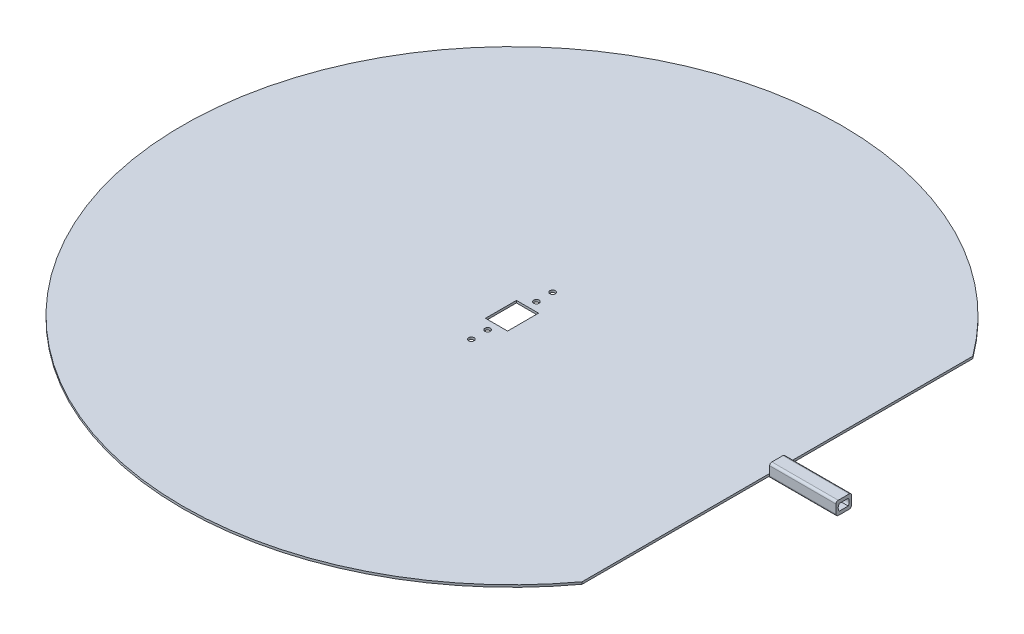
ISO-10303-21;
HEADER;
FILE_DESCRIPTION(('STEP AP214'),'2;1');
FILE_NAME('part.step','',(''),(''),'','','');
FILE_SCHEMA(('AUTOMOTIVE_DESIGN { 1 0 10303 214 1 1 1 1 }'));
ENDSEC;
DATA;
#1=APPLICATION_CONTEXT('core data for automotive mechanical design processes');
#2=APPLICATION_PROTOCOL_DEFINITION('international standard','automotive_design',2000,#1);
#3=PRODUCT_CONTEXT('',#1,'mechanical');
#4=PRODUCT('Part','Part','',(#3));
#5=PRODUCT_RELATED_PRODUCT_CATEGORY('part','',(#4));
#6=PRODUCT_DEFINITION_FORMATION('','',#4);
#7=PRODUCT_DEFINITION_CONTEXT('part definition',#1,'design');
#8=PRODUCT_DEFINITION('design','',#6,#7);
#9=PRODUCT_DEFINITION_SHAPE('','',#8);
#10=(LENGTH_UNIT() NAMED_UNIT(*) SI_UNIT(.MILLI.,.METRE.));
#11=(NAMED_UNIT(*) PLANE_ANGLE_UNIT() SI_UNIT($,.RADIAN.));
#12=(NAMED_UNIT(*) SI_UNIT($,.STERADIAN.) SOLID_ANGLE_UNIT());
#13=UNCERTAINTY_MEASURE_WITH_UNIT(LENGTH_MEASURE(1.E-05),#10,'distance_accuracy_value','');
#14=(GEOMETRIC_REPRESENTATION_CONTEXT(3) GLOBAL_UNCERTAINTY_ASSIGNED_CONTEXT((#13)) GLOBAL_UNIT_ASSIGNED_CONTEXT((#10,
#11,#12)) REPRESENTATION_CONTEXT('',''));
#15=CARTESIAN_POINT('',(0.,0.,0.));
#16=DIRECTION('',(0.,0.,1.));
#17=DIRECTION('',(1.,0.,0.));
#18=AXIS2_PLACEMENT_3D('',#15,#16,#17);
#19=CARTESIAN_POINT('',(0.,-2.,0.));
#20=DIRECTION('',(0.,1.,0.));
#21=DIRECTION('',(0.,0.,1.));
#22=AXIS2_PLACEMENT_3D('',#19,#20,#21);
#23=PLANE('',#22);
#24=CARTESIAN_POINT('',(0.,-2.,-18.4));
#25=DIRECTION('',(0.,1.,0.));
#26=DIRECTION('',(0.,0.,1.));
#27=AXIS2_PLACEMENT_3D('',#24,#25,#26);
#28=CIRCLE('',#27,1.25);
#29=CARTESIAN_POINT('',(0.,-2.,-17.15));
#30=VERTEX_POINT('',#29);
#31=EDGE_CURVE('E422',#30,#30,#28,.T.);
#32=ORIENTED_EDGE('',*,*,#31,.T.);
#33=EDGE_LOOP('',(#32));
#34=FACE_BOUND('',#33,.T.);
#35=CARTESIAN_POINT('',(0.,-2.,-11.));
#36=DIRECTION('',(0.,1.,0.));
#37=DIRECTION('',(0.,0.,1.));
#38=AXIS2_PLACEMENT_3D('',#35,#36,#37);
#39=CIRCLE('',#38,1.25);
#40=CARTESIAN_POINT('',(0.,-2.,-9.75));
#41=VERTEX_POINT('',#40);
#42=EDGE_CURVE('E416',#41,#41,#39,.T.);
#43=ORIENTED_EDGE('',*,*,#42,.T.);
#44=EDGE_LOOP('',(#43));
#45=FACE_BOUND('',#44,.T.);
#46=CARTESIAN_POINT('',(0.,-2.,18.4));
#47=DIRECTION('',(0.,1.,0.));
#48=DIRECTION('',(0.,0.,1.));
#49=AXIS2_PLACEMENT_3D('',#46,#47,#48);
#50=CIRCLE('',#49,1.25);
#51=CARTESIAN_POINT('',(0.,-2.,19.65));
#52=VERTEX_POINT('',#51);
#53=EDGE_CURVE('E410',#52,#52,#50,.T.);
#54=ORIENTED_EDGE('',*,*,#53,.T.);
#55=EDGE_LOOP('',(#54));
#56=FACE_BOUND('',#55,.T.);
#57=CARTESIAN_POINT('',(0.,-2.,11.));
#58=DIRECTION('',(0.,1.,0.));
#59=DIRECTION('',(0.,0.,1.));
#60=AXIS2_PLACEMENT_3D('',#57,#58,#59);
#61=CIRCLE('',#60,1.25);
#62=CARTESIAN_POINT('',(0.,-2.,12.25));
#63=VERTEX_POINT('',#62);
#64=EDGE_CURVE('E404',#63,#63,#61,.T.);
#65=ORIENTED_EDGE('',*,*,#64,.T.);
#66=EDGE_LOOP('',(#65));
#67=FACE_BOUND('',#66,.T.);
#68=DIRECTION('',(-0.999999999999999,0.,5.34839591885549E-08));
#69=VECTOR('',#68,1.);
#70=CARTESIAN_POINT('',(3.74387700017215E-07,-2.,6.9999997325802));
#71=LINE('',#70,#69);
#72=CARTESIAN_POINT('',(5.00000000000002,-2.,6.99999946516043));
#73=VERTEX_POINT('',#72);
#74=CARTESIAN_POINT('',(-4.99999999999998,-2.,7.00000000000002));
#75=VERTEX_POINT('',#74);
#76=EDGE_CURVE('E396',#73,#75,#71,.T.);
#77=ORIENTED_EDGE('',*,*,#76,.F.);
#78=DIRECTION('',(0.,0.,-1.));
#79=VECTOR('',#78,1.);
#80=CARTESIAN_POINT('',(5.,-2.,0.));
#81=LINE('',#80,#79);
#82=CARTESIAN_POINT('',(4.99999999999998,-2.,-7.00000000000002));
#83=VERTEX_POINT('',#82);
#84=EDGE_CURVE('E398',#73,#83,#81,.T.);
#85=ORIENTED_EDGE('',*,*,#84,.T.);
#86=DIRECTION('',(-1.,0.,0.));
#87=VECTOR('',#86,1.);
#88=CARTESIAN_POINT('',(0.,-2.,-7.));
#89=LINE('',#88,#87);
#90=CARTESIAN_POINT('',(-5.00000038202827,-2.,-6.99999999999998));
#91=VERTEX_POINT('',#90);
#92=EDGE_CURVE('E383',#83,#91,#89,.T.);
#93=ORIENTED_EDGE('',*,*,#92,.T.);
#94=DIRECTION('',(-2.72877354393075E-08,0.,-1.));
#95=VECTOR('',#94,1.);
#96=CARTESIAN_POINT('',(-5.00000019101412,-2.,1.3643868240888E-07));
#97=LINE('',#96,#95);
#98=EDGE_CURVE('E393',#75,#91,#97,.T.);
#99=ORIENTED_EDGE('',*,*,#98,.F.);
#100=EDGE_LOOP('',(#77,#85,#93,#99));
#101=FACE_BOUND('',#100,.T.);
#102=DIRECTION('',(1.,0.,0.));
#103=VECTOR('',#102,1.);
#104=CARTESIAN_POINT('',(100.,-2.,-3.5));
#105=LINE('',#104,#103);
#106=CARTESIAN_POINT('',(100.,-2.,-3.5));
#107=VERTEX_POINT('',#106);
#108=CARTESIAN_POINT('',(120.,-2.,-3.5));
#109=VERTEX_POINT('',#108);
#110=EDGE_CURVE('E225',#107,#109,#105,.T.);
#111=ORIENTED_EDGE('',*,*,#110,.F.);
#112=DIRECTION('',(0.,0.,-1.));
#113=VECTOR('',#112,1.);
#114=CARTESIAN_POINT('',(100.,-2.,-3.5));
#115=LINE('',#114,#113);
#116=CARTESIAN_POINT('',(100.,-2.,3.5));
#117=VERTEX_POINT('',#116);
#118=EDGE_CURVE('E222',#117,#107,#115,.T.);
#119=ORIENTED_EDGE('',*,*,#118,.F.);
#120=DIRECTION('',(1.,0.,0.));
#121=VECTOR('',#120,1.);
#122=CARTESIAN_POINT('',(100.,-2.,3.5));
#123=LINE('',#122,#121);
#124=CARTESIAN_POINT('',(120.,-2.,3.5));
#125=VERTEX_POINT('',#124);
#126=EDGE_CURVE('E217',#117,#125,#123,.T.);
#127=ORIENTED_EDGE('',*,*,#126,.T.);
#128=DIRECTION('',(0.,0.,1.));
#129=VECTOR('',#128,1.);
#130=CARTESIAN_POINT('',(120.,-2.,0.));
#131=LINE('',#130,#129);
#132=CARTESIAN_POINT('',(120.,-2.,88.3232698670062));
#133=VERTEX_POINT('',#132);
#134=EDGE_CURVE('E200',#125,#133,#131,.T.);
#135=ORIENTED_EDGE('',*,*,#134,.T.);
#136=CARTESIAN_POINT('',(0.,-2.,0.));
#137=DIRECTION('',(0.,1.,0.));
#138=DIRECTION('',(0.,0.,1.));
#139=AXIS2_PLACEMENT_3D('',#136,#137,#138);
#140=CIRCLE('',#139,149.);
#141=CARTESIAN_POINT('',(120.,-2.,-88.3232698670062));
#142=VERTEX_POINT('',#141);
#143=EDGE_CURVE('E448',#133,#142,#140,.F.);
#144=ORIENTED_EDGE('',*,*,#143,.T.);
#145=DIRECTION('',(0.,0.,1.));
#146=VECTOR('',#145,1.);
#147=CARTESIAN_POINT('',(120.,-2.,0.));
#148=LINE('',#147,#146);
#149=EDGE_CURVE('E210',#142,#109,#148,.T.);
#150=ORIENTED_EDGE('',*,*,#149,.T.);
#151=EDGE_LOOP('',(#111,#119,#127,#135,#144,#150));
#152=FACE_BOUND('',#151,.T.);
#153=ADVANCED_FACE('F35',(#34,#45,#56,#67,#101,#152),#23,.F.);
#154=CARTESIAN_POINT('',(0.,-2.,0.));
#155=DIRECTION('',(0.,1.,0.));
#156=DIRECTION('',(0.,0.,1.));
#157=AXIS2_PLACEMENT_3D('',#154,#155,#156);
#158=CYLINDRICAL_SURFACE('',#157,150.);
#159=CARTESIAN_POINT('',(0.,-1.5,0.));
#160=DIRECTION('',(0.,1.,0.));
#161=DIRECTION('',(0.,0.,1.));
#162=AXIS2_PLACEMENT_3D('',#159,#160,#161);
#163=CIRCLE('',#162,150.);
#164=CARTESIAN_POINT('',(149.986666074021,-1.5,-2.));
#165=VERTEX_POINT('',#164);
#166=CARTESIAN_POINT('',(149.986666074021,-1.5,2.));
#167=VERTEX_POINT('',#166);
#168=EDGE_CURVE('E229',#165,#167,#163,.F.);
#169=ORIENTED_EDGE('',*,*,#168,.T.);
#170=CARTESIAN_POINT('',(149.986666074021,-1.5,2.));
#171=CARTESIAN_POINT('',(149.986103399926,-1.44376147557048,2.04218730430361));
#172=CARTESIAN_POINT('',(149.985554970926,-1.38573803163374,2.08198960166665));
#173=CARTESIAN_POINT('',(149.984501249831,-1.26654948633278,2.15656804484799));
#174=CARTESIAN_POINT('',(149.983995955741,-1.20538453058681,2.19134442334782));
#175=CARTESIAN_POINT('',(149.983043341327,-1.08036800399035,2.25560232157057));
#176=CARTESIAN_POINT('',(149.982595991328,-1.01651783070239,2.28508655458666));
#177=CARTESIAN_POINT('',(149.981771536725,-0.886581353090935,2.33857146655465));
#178=CARTESIAN_POINT('',(149.981394431214,-0.82049507764684,2.3625722162951));
#179=CARTESIAN_POINT('',(149.980385171177,-0.619509693662875,2.42608906194667));
#180=CARTESIAN_POINT('',(149.979874604954,-0.481824614491602,2.4571502255549));
#181=CARTESIAN_POINT('',(149.979238277518,-0.203303812980876,2.49568724644412));
#182=CARTESIAN_POINT('',(149.979112410956,-0.0624689638496181,2.50316956080924));
#183=CARTESIAN_POINT('',(149.979258598212,0.21847689000018,2.4943959991721));
#184=CARTESIAN_POINT('',(149.979530667254,0.358587866821312,2.47813921503385));
#185=CARTESIAN_POINT('',(149.980442427065,0.634114760547301,2.42232418075987));
#186=CARTESIAN_POINT('',(149.981082127668,0.769530551749913,2.3827653072763));
#187=CARTESIAN_POINT('',(149.982511489491,1.00756751057895,2.29084062772818));
#188=CARTESIAN_POINT('',(149.983251843522,1.1116357413275,2.24217463077058));
#189=CARTESIAN_POINT('',(149.984870178064,1.31204495862778,2.13112752794897));
#190=CARTESIAN_POINT('',(149.985748026958,1.40839320321528,2.06875951566994));
#191=CARTESIAN_POINT('',(149.986666074021,1.5,2.));
#192=B_SPLINE_CURVE_WITH_KNOTS('',3,(#170,#171,#172,#173,#174,#175,#176,#177,#178,#179,#180,
#181,#182,#183,#184,#185,#186,#187,#188,#189,#190,#191),.UNSPECIFIED.,.F.,.F.,(4,2,2,2,2,2,2,2,
2,2,4),(0.,0.210847810060391,0.421685855514746,0.632415493188826,0.843142410313451,
1.26439845038451,1.6855391191688,2.10669589905436,2.52786394570194,2.871475085593,
3.21475928946426),.UNSPECIFIED.);
#193=CARTESIAN_POINT('',(149.986666074021,1.5,2.));
#194=VERTEX_POINT('',#193);
#195=EDGE_CURVE('E349',#167,#194,#192,.T.);
#196=ORIENTED_EDGE('',*,*,#195,.T.);
#197=CARTESIAN_POINT('',(0.,1.5,0.));
#198=DIRECTION('',(0.,1.,0.));
#199=DIRECTION('',(0.,0.,1.));
#200=AXIS2_PLACEMENT_3D('',#197,#198,#199);
#201=CIRCLE('',#200,150.);
#202=CARTESIAN_POINT('',(149.986666074021,1.5,-2.));
#203=VERTEX_POINT('',#202);
#204=EDGE_CURVE('E480',#203,#194,#201,.F.);
#205=ORIENTED_EDGE('',*,*,#204,.F.);
#206=CARTESIAN_POINT('',(149.986666074021,1.5,-2.));
#207=CARTESIAN_POINT('',(149.986103399926,1.44376147557048,-2.04218730430361));
#208=CARTESIAN_POINT('',(149.985554970926,1.38573803163374,-2.08198960166665));
#209=CARTESIAN_POINT('',(149.984501249831,1.26654948633278,-2.15656804484799));
#210=CARTESIAN_POINT('',(149.983995955741,1.20538453058681,-2.19134442334782));
#211=CARTESIAN_POINT('',(149.983043341327,1.08036800399035,-2.25560232157057));
#212=CARTESIAN_POINT('',(149.982595991328,1.01651783070239,-2.28508655458666));
#213=CARTESIAN_POINT('',(149.981771536725,0.886581353090935,-2.33857146655465));
#214=CARTESIAN_POINT('',(149.981394431214,0.82049507764684,-2.3625722162951));
#215=CARTESIAN_POINT('',(149.980385171177,0.619509693662875,-2.42608906194667));
#216=CARTESIAN_POINT('',(149.979874604954,0.481824614491602,-2.4571502255549));
#217=CARTESIAN_POINT('',(149.979238277518,0.203303812980876,-2.49568724644412));
#218=CARTESIAN_POINT('',(149.979112410956,0.0624689638496185,-2.50316956080924));
#219=CARTESIAN_POINT('',(149.979258598212,-0.21847689000018,-2.4943959991721));
#220=CARTESIAN_POINT('',(149.979530667254,-0.358587866821312,-2.47813921503385));
#221=CARTESIAN_POINT('',(149.980442427065,-0.634114760547301,-2.42232418075987));
#222=CARTESIAN_POINT('',(149.981082127668,-0.769530551749913,-2.3827653072763));
#223=CARTESIAN_POINT('',(149.982511489491,-1.00756751057895,-2.29084062772818));
#224=CARTESIAN_POINT('',(149.983251843522,-1.1116357413275,-2.24217463077058));
#225=CARTESIAN_POINT('',(149.984870178064,-1.31204495862778,-2.13112752794897));
#226=CARTESIAN_POINT('',(149.985748026958,-1.40839320321528,-2.06875951566994));
#227=CARTESIAN_POINT('',(149.986666074021,-1.5,-2.));
#228=B_SPLINE_CURVE_WITH_KNOTS('',3,(#206,#207,#208,#209,#210,#211,#212,#213,#214,#215,#216,
#217,#218,#219,#220,#221,#222,#223,#224,#225,#226,#227),.UNSPECIFIED.,.F.,.F.,(4,2,2,2,2,2,2,2,
2,2,4),(0.,0.210847810060391,0.421685855514746,0.632415493188825,0.843142410313451,
1.26439845038451,1.6855391191688,2.10669589905436,2.52786394570194,2.871475085593,
3.21475928946426),.UNSPECIFIED.);
#229=EDGE_CURVE('E358',#203,#165,#228,.T.);
#230=ORIENTED_EDGE('',*,*,#229,.T.);
#231=EDGE_LOOP('',(#169,#196,#205,#230));
#232=FACE_BOUND('',#231,.T.);
#233=CARTESIAN_POINT('',(149.979165219706,-3.,-2.5));
#234=CARTESIAN_POINT('',(149.978696210888,-2.99999981114114,-2.5281392831768));
#235=CARTESIAN_POINT('',(149.978219408723,-2.99881152657003,-2.55626494725666));
#236=CARTESIAN_POINT('',(149.977253593627,-2.99407103155763,-2.61231473547907));
#237=CARTESIAN_POINT('',(149.976764581285,-2.99051893513217,-2.64023886927654));
#238=CARTESIAN_POINT('',(149.975285849188,-2.97635073126825,-2.72336022897677));
#239=CARTESIAN_POINT('',(149.974282866816,-2.96222261540504,-2.7780002707181));
#240=CARTESIAN_POINT('',(149.972279493735,-2.92499291797882,-2.88413078542127));
#241=CARTESIAN_POINT('',(149.971279104497,-2.90188703962231,-2.93561973657939));
#242=CARTESIAN_POINT('',(149.969321358921,-2.84735981314007,-3.03398608481495));
#243=CARTESIAN_POINT('',(149.968363995045,-2.81593992830997,-3.0808642914107));
#244=CARTESIAN_POINT('',(149.966534309224,-2.74567589861799,-3.1686780284242));
#245=CARTESIAN_POINT('',(149.965661985717,-2.70683189019411,-3.20961366802808));
#246=CARTESIAN_POINT('',(149.964042950676,-2.62281092619358,-3.28439101090537));
#247=CARTESIAN_POINT('',(149.963296263668,-2.57763273722001,-3.31823132936171));
#248=CARTESIAN_POINT('',(149.961965354355,-2.48223696234534,-3.37784538471518));
#249=CARTESIAN_POINT('',(149.961381137272,-2.4320192144808,-3.4036188622471));
#250=CARTESIAN_POINT('',(149.960405087247,-2.3279775520407,-3.44635544015133));
#251=CARTESIAN_POINT('',(149.960013140953,-2.2741557834819,-3.46332373182451));
#252=CARTESIAN_POINT('',(149.959539863462,-2.18333621669745,-3.48374355532954));
#253=CARTESIAN_POINT('',(149.959398081214,-2.14691061408731,-3.48983602977973));
#254=CARTESIAN_POINT('',(149.959208635435,-2.07366177606131,-3.49796371330887));
#255=CARTESIAN_POINT('',(149.959160838581,-2.03683917852212,-3.50000466972253));
#256=CARTESIAN_POINT('',(149.959161107283,-2.,-3.5));
#257=B_SPLINE_CURVE_WITH_KNOTS('',3,(#233,#234,#235,#236,#237,#238,#239,#240,#241,#242,#243,
#244,#245,#246,#247,#248,#249,#250,#251,#252,#253,#254,#255,#256),.UNSPECIFIED.,.F.,.F.,(4,2,2,
2,2,2,2,2,2,2,2,4),(0.,0.084377707144503,0.168751344719861,0.337220592388087,0.505770569636257,
0.674290901179576,0.842808136011989,1.01135823035216,1.17991374336152,1.34836976734145,
1.45895548111381,1.56938420963109),.UNSPECIFIED.);
#258=CARTESIAN_POINT('',(149.979165219706,-3.,-2.5));
#259=VERTEX_POINT('',#258);
#260=CARTESIAN_POINT('',(149.959161107283,-2.,-3.5));
#261=VERTEX_POINT('',#260);
#262=EDGE_CURVE('E532',#259,#261,#257,.T.);
#263=ORIENTED_EDGE('',*,*,#262,.T.);
#264=DIRECTION('',(0.,-1.,0.));
#265=VECTOR('',#264,1.);
#266=CARTESIAN_POINT('',(149.959161107283,3.,-3.5));
#267=LINE('',#266,#265);
#268=CARTESIAN_POINT('',(149.959161107283,2.,-3.5));
#269=VERTEX_POINT('',#268);
#270=EDGE_CURVE('E377',#269,#261,#267,.T.);
#271=ORIENTED_EDGE('',*,*,#270,.F.);
#272=CARTESIAN_POINT('',(149.959161107283,2.,-3.5));
#273=CARTESIAN_POINT('',(149.959161065757,2.02812964397928,-3.49999981713595));
#274=CARTESIAN_POINT('',(149.959188831904,2.05624580923046,-3.49881233977866));
#275=CARTESIAN_POINT('',(149.959299304671,2.11227689224548,-3.49407503762317));
#276=CARTESIAN_POINT('',(149.959382008618,2.14019181973277,-3.49052532774779));
#277=CARTESIAN_POINT('',(149.959711154832,2.22328550256291,-3.47636670322655));
#278=CARTESIAN_POINT('',(149.960038636095,2.27790757750145,-3.46224819936413));
#279=CARTESIAN_POINT('',(149.960892945646,2.38400382714246,-3.4250443845581));
#280=CARTESIAN_POINT('',(149.961419868966,2.43547648756831,-3.40195479882022));
#281=CARTESIAN_POINT('',(149.962646024439,2.53381319375798,-3.3474672527269));
#282=CARTESIAN_POINT('',(149.963345226708,2.58067803684912,-3.31607073326903));
#283=CARTESIAN_POINT('',(149.964881393321,2.66847618979314,-3.2458555512694));
#284=CARTESIAN_POINT('',(149.965718375501,2.70940873041362,-3.20703592769633));
#285=CARTESIAN_POINT('',(149.967490480633,2.78418476843504,-3.12306875241342));
#286=CARTESIAN_POINT('',(149.968425622829,2.81802687189666,-3.07791995933161));
#287=CARTESIAN_POINT('',(149.970352281104,2.87766358683523,-2.98256760302618));
#288=CARTESIAN_POINT('',(149.971343821334,2.90345471965645,-2.93236186716142));
#289=CARTESIAN_POINT('',(149.973341544026,2.94622850732924,-2.82834304565654));
#290=CARTESIAN_POINT('',(149.974347717579,2.96321630821072,-2.7745320882898));
#291=CARTESIAN_POINT('',(149.975995640224,2.98368549016434,-2.68366072301176));
#292=CARTESIAN_POINT('',(149.976644236898,2.98979968329529,-2.64717173421447));
#293=CARTESIAN_POINT('',(149.977921522935,2.99795640994168,-2.57379367408336));
#294=CARTESIAN_POINT('',(149.978550239228,3.00000470617947,-2.53690524361012));
#295=CARTESIAN_POINT('',(149.979165219706,3.,-2.5));
#296=B_SPLINE_CURVE_WITH_KNOTS('',3,(#272,#273,#274,#275,#276,#277,#278,#279,#280,#281,#282,
#283,#284,#285,#286,#287,#288,#289,#290,#291,#292,#293,#294,#295),.UNSPECIFIED.,.F.,.F.,(4,2,2,
2,2,2,2,2,2,2,2,4),(0.,0.0843370897669879,0.168670076827656,0.33705639910897,0.505523057457654,
0.673960513185251,0.842419790430585,1.0109121547932,1.17947722072828,1.34794363967897,
1.45874282497922,1.56938485869349),.UNSPECIFIED.);
#297=CARTESIAN_POINT('',(149.979165219706,3.,-2.5));
#298=VERTEX_POINT('',#297);
#299=EDGE_CURVE('E242',#269,#298,#296,.T.);
#300=ORIENTED_EDGE('',*,*,#299,.T.);
#301=CARTESIAN_POINT('',(0.,3.,0.));
#302=DIRECTION('',(0.,1.,0.));
#303=DIRECTION('',(0.,0.,1.));
#304=AXIS2_PLACEMENT_3D('',#301,#302,#303);
#305=CIRCLE('',#304,150.);
#306=CARTESIAN_POINT('',(149.979165219706,3.,2.5));
#307=VERTEX_POINT('',#306);
#308=EDGE_CURVE('E193',#307,#298,#305,.T.);
#309=ORIENTED_EDGE('',*,*,#308,.F.);
#310=CARTESIAN_POINT('',(149.979165219706,3.,2.5));
#311=CARTESIAN_POINT('',(149.978696210888,2.99999981114114,2.52813928317679));
#312=CARTESIAN_POINT('',(149.978219408723,2.99881152657003,2.55626494725666));
#313=CARTESIAN_POINT('',(149.977253593627,2.99407103155763,2.61231473547906));
#314=CARTESIAN_POINT('',(149.976764581285,2.99051893513217,2.64023886927654));
#315=CARTESIAN_POINT('',(149.975285849188,2.97635073126825,2.72336022897676));
#316=CARTESIAN_POINT('',(149.974282866816,2.96222261540504,2.7780002707181));
#317=CARTESIAN_POINT('',(149.972279493735,2.92499291797882,2.88413078542127));
#318=CARTESIAN_POINT('',(149.971279104497,2.90188703962231,2.93561973657939));
#319=CARTESIAN_POINT('',(149.969321358921,2.84735981314007,3.03398608481495));
#320=CARTESIAN_POINT('',(149.968363995045,2.81593992830997,3.0808642914107));
#321=CARTESIAN_POINT('',(149.966534309224,2.74567589861799,3.1686780284242));
#322=CARTESIAN_POINT('',(149.965661985717,2.70683189019411,3.20961366802808));
#323=CARTESIAN_POINT('',(149.964042950676,2.62281092619358,3.28439101090537));
#324=CARTESIAN_POINT('',(149.963296263668,2.57763273722001,3.31823132936171));
#325=CARTESIAN_POINT('',(149.961965354355,2.48223696234534,3.37784538471518));
#326=CARTESIAN_POINT('',(149.961381137272,2.4320192144808,3.40361886224709));
#327=CARTESIAN_POINT('',(149.960405087247,2.3279775520407,3.44635544015133));
#328=CARTESIAN_POINT('',(149.960013140953,2.2741557834819,3.46332373182451));
#329=CARTESIAN_POINT('',(149.959539863462,2.18333621669745,3.48374355532954));
#330=CARTESIAN_POINT('',(149.959398081214,2.14691061408731,3.48983602977973));
#331=CARTESIAN_POINT('',(149.959208635435,2.07366177606131,3.49796371330886));
#332=CARTESIAN_POINT('',(149.959160838581,2.03683917852212,3.50000466972253));
#333=CARTESIAN_POINT('',(149.959161107283,2.,3.5));
#334=B_SPLINE_CURVE_WITH_KNOTS('',3,(#310,#311,#312,#313,#314,#315,#316,#317,#318,#319,#320,
#321,#322,#323,#324,#325,#326,#327,#328,#329,#330,#331,#332,#333),.UNSPECIFIED.,.F.,.F.,(4,2,2,
2,2,2,2,2,2,2,2,4),(0.,0.084377707144503,0.168751344719861,0.337220592388087,0.505770569636257,
0.674290901179576,0.842808136011989,1.01135823035216,1.17991374336152,1.34836976734145,
1.45895548111381,1.56938420963109),.UNSPECIFIED.);
#335=CARTESIAN_POINT('',(149.959161107283,2.,3.5));
#336=VERTEX_POINT('',#335);
#337=EDGE_CURVE('E250',#307,#336,#334,.T.);
#338=ORIENTED_EDGE('',*,*,#337,.T.);
#339=DIRECTION('',(0.,-1.,0.));
#340=VECTOR('',#339,1.);
#341=CARTESIAN_POINT('',(149.959161107283,3.,3.5));
#342=LINE('',#341,#340);
#343=CARTESIAN_POINT('',(149.959161107283,-2.,3.5));
#344=VERTEX_POINT('',#343);
#345=EDGE_CURVE('E372',#336,#344,#342,.T.);
#346=ORIENTED_EDGE('',*,*,#345,.T.);
#347=CARTESIAN_POINT('',(149.959161107283,-2.,3.5));
#348=CARTESIAN_POINT('',(149.959161065757,-2.02812964397928,3.49999981713595));
#349=CARTESIAN_POINT('',(149.959188831904,-2.05624580923046,3.49881233977866));
#350=CARTESIAN_POINT('',(149.959299304671,-2.11227689224548,3.49407503762317));
#351=CARTESIAN_POINT('',(149.959382008618,-2.14019181973277,3.49052532774779));
#352=CARTESIAN_POINT('',(149.959711154832,-2.22328550256291,3.47636670322655));
#353=CARTESIAN_POINT('',(149.960038636095,-2.27790757750145,3.46224819936413));
#354=CARTESIAN_POINT('',(149.960892945646,-2.38400382714246,3.4250443845581));
#355=CARTESIAN_POINT('',(149.961419868966,-2.43547648756831,3.40195479882021));
#356=CARTESIAN_POINT('',(149.962646024439,-2.53381319375798,3.3474672527269));
#357=CARTESIAN_POINT('',(149.963345226708,-2.58067803684912,3.31607073326903));
#358=CARTESIAN_POINT('',(149.964881393321,-2.66847618979314,3.2458555512694));
#359=CARTESIAN_POINT('',(149.965718375501,-2.70940873041362,3.20703592769633));
#360=CARTESIAN_POINT('',(149.967490480633,-2.78418476843504,3.12306875241342));
#361=CARTESIAN_POINT('',(149.968425622829,-2.81802687189666,3.07791995933161));
#362=CARTESIAN_POINT('',(149.970352281104,-2.87766358683523,2.98256760302618));
#363=CARTESIAN_POINT('',(149.971343821334,-2.90345471965645,2.93236186716142));
#364=CARTESIAN_POINT('',(149.973341544026,-2.94622850732924,2.82834304565654));
#365=CARTESIAN_POINT('',(149.974347717579,-2.96321630821072,2.77453208828979));
#366=CARTESIAN_POINT('',(149.975995640224,-2.98368549016434,2.68366072301176));
#367=CARTESIAN_POINT('',(149.976644236898,-2.98979968329529,2.64717173421447));
#368=CARTESIAN_POINT('',(149.977921522935,-2.99795640994168,2.57379367408336));
#369=CARTESIAN_POINT('',(149.978550239228,-3.00000470617947,2.53690524361012));
#370=CARTESIAN_POINT('',(149.979165219706,-3.,2.5));
#371=B_SPLINE_CURVE_WITH_KNOTS('',3,(#347,#348,#349,#350,#351,#352,#353,#354,#355,#356,#357,
#358,#359,#360,#361,#362,#363,#364,#365,#366,#367,#368,#369,#370),.UNSPECIFIED.,.F.,.F.,(4,2,2,
2,2,2,2,2,2,2,2,4),(0.,0.0843370897669879,0.168670076827656,0.33705639910897,0.505523057457654,
0.673960513185251,0.842419790430585,1.0109121547932,1.17947722072828,1.34794363967897,
1.45874282497922,1.56938485869349),.UNSPECIFIED.);
#372=CARTESIAN_POINT('',(149.979165219706,-3.,2.5));
#373=VERTEX_POINT('',#372);
#374=EDGE_CURVE('E189',#344,#373,#371,.T.);
#375=ORIENTED_EDGE('',*,*,#374,.T.);
#376=CARTESIAN_POINT('',(0.,-3.,0.));
#377=DIRECTION('',(0.,1.,0.));
#378=DIRECTION('',(0.,0.,1.));
#379=AXIS2_PLACEMENT_3D('',#376,#377,#378);
#380=CIRCLE('',#379,150.);
#381=EDGE_CURVE('E357',#373,#259,#380,.T.);
#382=ORIENTED_EDGE('',*,*,#381,.T.);
#383=EDGE_LOOP('',(#263,#271,#300,#309,#338,#346,#375,#382));
#384=FACE_BOUND('',#383,.T.);
#385=ADVANCED_FACE('F257',(#232,#384),#158,.T.);
#386=CARTESIAN_POINT('',(120.,-1.,0.));
#387=DIRECTION('',(-1.,0.,0.));
#388=DIRECTION('',(0.,0.,1.));
#389=AXIS2_PLACEMENT_3D('',#386,#387,#388);
#390=PLANE('',#389);
#391=DIRECTION('',(0.,-1.,0.));
#392=VECTOR('',#391,1.);
#393=CARTESIAN_POINT('',(120.,3.,-3.5));
#394=LINE('',#393,#392);
#395=CARTESIAN_POINT('',(120.,2.,-3.5));
#396=VERTEX_POINT('',#395);
#397=CARTESIAN_POINT('',(120.,-1.,-3.5));
#398=VERTEX_POINT('',#397);
#399=EDGE_CURVE('E375',#396,#398,#394,.T.);
#400=ORIENTED_EDGE('',*,*,#399,.T.);
#401=DIRECTION('',(0.,0.,1.));
#402=VECTOR('',#401,1.);
#403=CARTESIAN_POINT('',(120.,-1.,0.));
#404=LINE('',#403,#402);
#405=CARTESIAN_POINT('',(120.,-1.,-2.29128784747792));
#406=VERTEX_POINT('',#405);
#407=EDGE_CURVE('E438',#398,#406,#404,.T.);
#408=ORIENTED_EDGE('',*,*,#407,.T.);
#409=CARTESIAN_POINT('',(120.,0.,0.));
#410=DIRECTION('',(1.,0.,0.));
#411=DIRECTION('',(0.,0.,-1.));
#412=AXIS2_PLACEMENT_3D('',#409,#410,#411);
#413=CIRCLE('',#412,2.5);
#414=CARTESIAN_POINT('',(120.,1.5,-2.));
#415=VERTEX_POINT('',#414);
#416=EDGE_CURVE('E466',#406,#415,#413,.T.);
#417=ORIENTED_EDGE('',*,*,#416,.T.);
#418=DIRECTION('',(0.,0.,-1.));
#419=VECTOR('',#418,1.);
#420=CARTESIAN_POINT('',(120.,1.5,2.));
#421=LINE('',#420,#419);
#422=CARTESIAN_POINT('',(120.,1.5,2.));
#423=VERTEX_POINT('',#422);
#424=EDGE_CURVE('E470',#423,#415,#421,.T.);
#425=ORIENTED_EDGE('',*,*,#424,.F.);
#426=CARTESIAN_POINT('',(120.,0.,0.));
#427=DIRECTION('',(1.,0.,0.));
#428=DIRECTION('',(0.,0.,-1.));
#429=AXIS2_PLACEMENT_3D('',#426,#427,#428);
#430=CIRCLE('',#429,2.5);
#431=CARTESIAN_POINT('',(120.,-1.,2.29128784747792));
#432=VERTEX_POINT('',#431);
#433=EDGE_CURVE('E460',#423,#432,#430,.T.);
#434=ORIENTED_EDGE('',*,*,#433,.T.);
#435=CARTESIAN_POINT('',(120.,-1.,3.5));
#436=VERTEX_POINT('',#435);
#437=EDGE_CURVE('E435',#432,#436,#404,.T.);
#438=ORIENTED_EDGE('',*,*,#437,.T.);
#439=DIRECTION('',(0.,-1.,0.));
#440=VECTOR('',#439,1.);
#441=CARTESIAN_POINT('',(120.,3.,3.5));
#442=LINE('',#441,#440);
#443=CARTESIAN_POINT('',(120.,2.,3.5));
#444=VERTEX_POINT('',#443);
#445=EDGE_CURVE('E216',#444,#436,#442,.T.);
#446=ORIENTED_EDGE('',*,*,#445,.F.);
#447=CARTESIAN_POINT('',(120.,2.,2.5));
#448=DIRECTION('',(-1.,0.,0.));
#449=DIRECTION('',(0.,0.,1.));
#450=AXIS2_PLACEMENT_3D('',#447,#448,#449);
#451=CIRCLE('',#450,1.);
#452=CARTESIAN_POINT('',(120.,3.,2.5));
#453=VERTEX_POINT('',#452);
#454=EDGE_CURVE('E527',#444,#453,#451,.T.);
#455=ORIENTED_EDGE('',*,*,#454,.T.);
#456=DIRECTION('',(0.,0.,1.));
#457=VECTOR('',#456,1.);
#458=CARTESIAN_POINT('',(120.,3.,0.));
#459=LINE('',#458,#457);
#460=CARTESIAN_POINT('',(120.,3.,-2.5));
#461=VERTEX_POINT('',#460);
#462=EDGE_CURVE('E369',#461,#453,#459,.T.);
#463=ORIENTED_EDGE('',*,*,#462,.F.);
#464=CARTESIAN_POINT('',(120.,2.,-2.5));
#465=DIRECTION('',(-1.,0.,0.));
#466=DIRECTION('',(0.,0.,1.));
#467=AXIS2_PLACEMENT_3D('',#464,#465,#466);
#468=CIRCLE('',#467,1.);
#469=EDGE_CURVE('E505',#461,#396,#468,.T.);
#470=ORIENTED_EDGE('',*,*,#469,.T.);
#471=EDGE_LOOP('',(#400,#408,#417,#425,#434,#438,#446,#455,#463,#470));
#472=FACE_BOUND('',#471,.T.);
#473=ADVANCED_FACE('F284',(#472),#390,.T.);
#474=CARTESIAN_POINT('',(0.,-1.,0.));
#475=DIRECTION('',(0.,1.,0.));
#476=DIRECTION('',(0.,0.,1.));
#477=AXIS2_PLACEMENT_3D('',#474,#475,#476);
#478=PLANE('',#477);
#479=DIRECTION('',(-2.72877354393075E-08,0.,-1.));
#480=VECTOR('',#479,1.);
#481=CARTESIAN_POINT('',(-5.00000019101412,-1.,1.3643868240888E-07));
#482=LINE('',#481,#480);
#483=CARTESIAN_POINT('',(-4.99999999999998,-1.,7.00000000000002));
#484=VERTEX_POINT('',#483);
#485=CARTESIAN_POINT('',(-5.00000038202827,-1.,-6.99999999999998));
#486=VERTEX_POINT('',#485);
#487=EDGE_CURVE('E433',#484,#486,#482,.T.);
#488=ORIENTED_EDGE('',*,*,#487,.T.);
#489=DIRECTION('',(-1.,0.,0.));
#490=VECTOR('',#489,1.);
#491=CARTESIAN_POINT('',(0.,-1.,-7.));
#492=LINE('',#491,#490);
#493=CARTESIAN_POINT('',(4.99999999999998,-1.,-7.00000000000002));
#494=VERTEX_POINT('',#493);
#495=EDGE_CURVE('E424',#494,#486,#492,.T.);
#496=ORIENTED_EDGE('',*,*,#495,.F.);
#497=DIRECTION('',(0.,0.,-1.));
#498=VECTOR('',#497,1.);
#499=CARTESIAN_POINT('',(5.,-1.,0.));
#500=LINE('',#499,#498);
#501=CARTESIAN_POINT('',(5.00000000000002,-1.,6.99999946516043));
#502=VERTEX_POINT('',#501);
#503=EDGE_CURVE('E427',#502,#494,#500,.T.);
#504=ORIENTED_EDGE('',*,*,#503,.F.);
#505=DIRECTION('',(-0.999999999999999,0.,5.34839591885549E-08));
#506=VECTOR('',#505,1.);
#507=CARTESIAN_POINT('',(3.74387700017215E-07,-1.,6.9999997325802));
#508=LINE('',#507,#506);
#509=EDGE_CURVE('E430',#502,#484,#508,.T.);
#510=ORIENTED_EDGE('',*,*,#509,.T.);
#511=EDGE_LOOP('',(#488,#496,#504,#510));
#512=FACE_BOUND('',#511,.T.);
#513=CARTESIAN_POINT('',(0.,-1.,-18.4));
#514=DIRECTION('',(0.,1.,0.));
#515=DIRECTION('',(0.,0.,1.));
#516=AXIS2_PLACEMENT_3D('',#513,#514,#515);
#517=CIRCLE('',#516,1.25);
#518=CARTESIAN_POINT('',(0.,-1.,-17.15));
#519=VERTEX_POINT('',#518);
#520=EDGE_CURVE('E419',#519,#519,#517,.T.);
#521=ORIENTED_EDGE('',*,*,#520,.F.);
#522=EDGE_LOOP('',(#521));
#523=FACE_BOUND('',#522,.T.);
#524=CARTESIAN_POINT('',(0.,-1.,-11.));
#525=DIRECTION('',(0.,1.,0.));
#526=DIRECTION('',(0.,0.,1.));
#527=AXIS2_PLACEMENT_3D('',#524,#525,#526);
#528=CIRCLE('',#527,1.25);
#529=CARTESIAN_POINT('',(0.,-1.,-9.75));
#530=VERTEX_POINT('',#529);
#531=EDGE_CURVE('E413',#530,#530,#528,.T.);
#532=ORIENTED_EDGE('',*,*,#531,.F.);
#533=EDGE_LOOP('',(#532));
#534=FACE_BOUND('',#533,.T.);
#535=CARTESIAN_POINT('',(0.,-1.,18.4));
#536=DIRECTION('',(0.,1.,0.));
#537=DIRECTION('',(0.,0.,1.));
#538=AXIS2_PLACEMENT_3D('',#535,#536,#537);
#539=CIRCLE('',#538,1.25);
#540=CARTESIAN_POINT('',(0.,-1.,19.65));
#541=VERTEX_POINT('',#540);
#542=EDGE_CURVE('E407',#541,#541,#539,.T.);
#543=ORIENTED_EDGE('',*,*,#542,.F.);
#544=EDGE_LOOP('',(#543));
#545=FACE_BOUND('',#544,.T.);
#546=CARTESIAN_POINT('',(0.,-1.,11.));
#547=DIRECTION('',(0.,1.,0.));
#548=DIRECTION('',(0.,0.,1.));
#549=AXIS2_PLACEMENT_3D('',#546,#547,#548);
#550=CIRCLE('',#549,1.25);
#551=CARTESIAN_POINT('',(0.,-1.,12.25));
#552=VERTEX_POINT('',#551);
#553=EDGE_CURVE('E401',#552,#552,#550,.T.);
#554=ORIENTED_EDGE('',*,*,#553,.F.);
#555=EDGE_LOOP('',(#554));
#556=FACE_BOUND('',#555,.T.);
#557=CARTESIAN_POINT('',(120.,-1.,-88.3232698670062));
#558=VERTEX_POINT('',#557);
#559=EDGE_CURVE('E436',#558,#398,#404,.T.);
#560=ORIENTED_EDGE('',*,*,#559,.F.);
#561=CARTESIAN_POINT('',(0.,-1.,0.));
#562=DIRECTION('',(0.,1.,0.));
#563=DIRECTION('',(0.,0.,1.));
#564=AXIS2_PLACEMENT_3D('',#561,#562,#563);
#565=CIRCLE('',#564,149.);
#566=CARTESIAN_POINT('',(120.,-1.,88.3232698670062));
#567=VERTEX_POINT('',#566);
#568=EDGE_CURVE('E235',#558,#567,#565,.T.);
#569=ORIENTED_EDGE('',*,*,#568,.T.);
#570=DIRECTION('',(0.,0.,1.));
#571=VECTOR('',#570,1.);
#572=CARTESIAN_POINT('',(120.,-1.,0.));
#573=LINE('',#572,#571);
#574=EDGE_CURVE('E211',#436,#567,#573,.T.);
#575=ORIENTED_EDGE('',*,*,#574,.F.);
#576=ORIENTED_EDGE('',*,*,#437,.F.);
#577=EDGE_CURVE('E439',#406,#432,#404,.T.);
#578=ORIENTED_EDGE('',*,*,#577,.F.);
#579=ORIENTED_EDGE('',*,*,#407,.F.);
#580=EDGE_LOOP('',(#560,#569,#575,#576,#578,#579));
#581=FACE_BOUND('',#580,.T.);
#582=ADVANCED_FACE('F291',(#512,#523,#534,#545,#556,#581),#478,.T.);
#583=CARTESIAN_POINT('',(5.,-13.,0.));
#584=DIRECTION('',(1.,0.,0.));
#585=DIRECTION('',(0.,0.,-1.));
#586=AXIS2_PLACEMENT_3D('',#583,#584,#585);
#587=PLANE('',#586);
#588=DIRECTION('',(0.,1.,0.));
#589=VECTOR('',#588,1.);
#590=CARTESIAN_POINT('',(5.00000000000002,-13.,6.99999946516043));
#591=LINE('',#590,#589);
#592=EDGE_CURVE('E380',#73,#502,#591,.T.);
#593=ORIENTED_EDGE('',*,*,#592,.T.);
#594=ORIENTED_EDGE('',*,*,#503,.T.);
#595=DIRECTION('',(0.,1.,0.));
#596=VECTOR('',#595,1.);
#597=CARTESIAN_POINT('',(4.99999999999998,-13.,-7.00000000000002));
#598=LINE('',#597,#596);
#599=EDGE_CURVE('E379',#83,#494,#598,.T.);
#600=ORIENTED_EDGE('',*,*,#599,.F.);
#601=ORIENTED_EDGE('',*,*,#84,.F.);
#602=EDGE_LOOP('',(#593,#594,#600,#601));
#603=FACE_BOUND('',#602,.T.);
#604=ADVANCED_FACE('F295',(#603),#587,.F.);
#605=CARTESIAN_POINT('',(3.74387700017215E-07,-13.,6.9999997325802));
#606=DIRECTION('',(-5.34839591885549E-08,0.,-0.999999999999999));
#607=DIRECTION('',(-0.999999999999999,0.,5.34839591885549E-08));
#608=AXIS2_PLACEMENT_3D('',#605,#606,#607);
#609=PLANE('',#608);
#610=ORIENTED_EDGE('',*,*,#76,.T.);
#611=DIRECTION('',(0.,1.,0.));
#612=VECTOR('',#611,1.);
#613=CARTESIAN_POINT('',(-4.99999999999998,-13.,7.00000000000002));
#614=LINE('',#613,#612);
#615=EDGE_CURVE('E384',#75,#484,#614,.T.);
#616=ORIENTED_EDGE('',*,*,#615,.T.);
#617=ORIENTED_EDGE('',*,*,#509,.F.);
#618=ORIENTED_EDGE('',*,*,#592,.F.);
#619=EDGE_LOOP('',(#610,#616,#617,#618));
#620=FACE_BOUND('',#619,.T.);
#621=ADVANCED_FACE('F299',(#620),#609,.T.);
#622=CARTESIAN_POINT('',(-5.00000019101412,-13.,1.3643868240888E-07));
#623=DIRECTION('',(1.,0.,-2.72877354393075E-08));
#624=DIRECTION('',(-2.72877354393075E-08,0.,-1.));
#625=AXIS2_PLACEMENT_3D('',#622,#623,#624);
#626=PLANE('',#625);
#627=ORIENTED_EDGE('',*,*,#98,.T.);
#628=DIRECTION('',(0.,1.,0.));
#629=VECTOR('',#628,1.);
#630=CARTESIAN_POINT('',(-5.00000038202827,-13.,-6.99999999999998));
#631=LINE('',#630,#629);
#632=EDGE_CURVE('E387',#91,#486,#631,.T.);
#633=ORIENTED_EDGE('',*,*,#632,.T.);
#634=ORIENTED_EDGE('',*,*,#487,.F.);
#635=ORIENTED_EDGE('',*,*,#615,.F.);
#636=EDGE_LOOP('',(#627,#633,#634,#635));
#637=FACE_BOUND('',#636,.T.);
#638=ADVANCED_FACE('F305',(#637),#626,.T.);
#639=CARTESIAN_POINT('',(0.,-13.,-7.));
#640=DIRECTION('',(0.,0.,-1.));
#641=DIRECTION('',(-1.,0.,0.));
#642=AXIS2_PLACEMENT_3D('',#639,#640,#641);
#643=PLANE('',#642);
#644=ORIENTED_EDGE('',*,*,#599,.T.);
#645=ORIENTED_EDGE('',*,*,#495,.T.);
#646=ORIENTED_EDGE('',*,*,#632,.F.);
#647=ORIENTED_EDGE('',*,*,#92,.F.);
#648=EDGE_LOOP('',(#644,#645,#646,#647));
#649=FACE_BOUND('',#648,.T.);
#650=ADVANCED_FACE('F301',(#649),#643,.F.);
#651=CARTESIAN_POINT('',(0.,-13.,11.));
#652=DIRECTION('',(0.,1.,0.));
#653=DIRECTION('',(0.,0.,1.));
#654=AXIS2_PLACEMENT_3D('',#651,#652,#653);
#655=CYLINDRICAL_SURFACE('',#654,1.25);
#656=ORIENTED_EDGE('',*,*,#553,.T.);
#657=EDGE_LOOP('',(#656));
#658=FACE_BOUND('',#657,.T.);
#659=ORIENTED_EDGE('',*,*,#64,.F.);
#660=EDGE_LOOP('',(#659));
#661=FACE_BOUND('',#660,.T.);
#662=ADVANCED_FACE('F304',(#658,#661),#655,.F.);
#663=CARTESIAN_POINT('',(0.,-13.,18.4));
#664=DIRECTION('',(0.,1.,0.));
#665=DIRECTION('',(0.,0.,1.));
#666=AXIS2_PLACEMENT_3D('',#663,#664,#665);
#667=CYLINDRICAL_SURFACE('',#666,1.25);
#668=ORIENTED_EDGE('',*,*,#542,.T.);
#669=EDGE_LOOP('',(#668));
#670=FACE_BOUND('',#669,.T.);
#671=ORIENTED_EDGE('',*,*,#53,.F.);
#672=EDGE_LOOP('',(#671));
#673=FACE_BOUND('',#672,.T.);
#674=ADVANCED_FACE('F321',(#670,#673),#667,.F.);
#675=CARTESIAN_POINT('',(0.,-13.,-11.));
#676=DIRECTION('',(0.,1.,0.));
#677=DIRECTION('',(0.,0.,1.));
#678=AXIS2_PLACEMENT_3D('',#675,#676,#677);
#679=CYLINDRICAL_SURFACE('',#678,1.25);
#680=ORIENTED_EDGE('',*,*,#531,.T.);
#681=EDGE_LOOP('',(#680));
#682=FACE_BOUND('',#681,.T.);
#683=ORIENTED_EDGE('',*,*,#42,.F.);
#684=EDGE_LOOP('',(#683));
#685=FACE_BOUND('',#684,.T.);
#686=ADVANCED_FACE('F317',(#682,#685),#679,.F.);
#687=CARTESIAN_POINT('',(0.,-13.,-18.4));
#688=DIRECTION('',(0.,1.,0.));
#689=DIRECTION('',(0.,0.,1.));
#690=AXIS2_PLACEMENT_3D('',#687,#688,#689);
#691=CYLINDRICAL_SURFACE('',#690,1.25);
#692=ORIENTED_EDGE('',*,*,#520,.T.);
#693=EDGE_LOOP('',(#692));
#694=FACE_BOUND('',#693,.T.);
#695=ORIENTED_EDGE('',*,*,#31,.F.);
#696=EDGE_LOOP('',(#695));
#697=FACE_BOUND('',#696,.T.);
#698=ADVANCED_FACE('F313',(#694,#697),#691,.F.);
#699=CARTESIAN_POINT('',(0.,3.,-3.49999999999998));
#700=DIRECTION('',(0.,0.,1.));
#701=DIRECTION('',(1.,0.,0.));
#702=AXIS2_PLACEMENT_3D('',#699,#700,#701);
#703=PLANE('',#702);
#704=ORIENTED_EDGE('',*,*,#399,.F.);
#705=DIRECTION('',(-1.,0.,0.));
#706=VECTOR('',#705,1.);
#707=CARTESIAN_POINT('',(149.959161107283,2.,-3.5));
#708=LINE('',#707,#706);
#709=EDGE_CURVE('E520',#396,#269,#708,.F.);
#710=ORIENTED_EDGE('',*,*,#709,.T.);
#711=ORIENTED_EDGE('',*,*,#270,.T.);
#712=DIRECTION('',(-1.,0.,0.));
#713=VECTOR('',#712,1.);
#714=CARTESIAN_POINT('',(0.,-2.,-3.49999999999998));
#715=LINE('',#714,#713);
#716=EDGE_CURVE('E194',#261,#109,#715,.T.);
#717=ORIENTED_EDGE('',*,*,#716,.T.);
#718=DIRECTION('',(0.,1.,0.));
#719=VECTOR('',#718,1.);
#720=CARTESIAN_POINT('',(120.,-3.,-3.5));
#721=LINE('',#720,#719);
#722=EDGE_CURVE('E452',#109,#398,#721,.T.);
#723=ORIENTED_EDGE('',*,*,#722,.T.);
#724=EDGE_LOOP('',(#704,#710,#711,#717,#723));
#725=FACE_BOUND('',#724,.T.);
#726=ADVANCED_FACE('F316',(#725),#703,.F.);
#727=CARTESIAN_POINT('',(0.,3.,3.50000000000002));
#728=DIRECTION('',(0.,0.,1.));
#729=DIRECTION('',(1.,0.,0.));
#730=AXIS2_PLACEMENT_3D('',#727,#728,#729);
#731=PLANE('',#730);
#732=ORIENTED_EDGE('',*,*,#345,.F.);
#733=DIRECTION('',(-1.,0.,0.));
#734=VECTOR('',#733,1.);
#735=CARTESIAN_POINT('',(0.,2.,3.50000000000002));
#736=LINE('',#735,#734);
#737=EDGE_CURVE('E530',#336,#444,#736,.T.);
#738=ORIENTED_EDGE('',*,*,#737,.T.);
#739=ORIENTED_EDGE('',*,*,#445,.T.);
#740=DIRECTION('',(0.,1.,0.));
#741=VECTOR('',#740,1.);
#742=CARTESIAN_POINT('',(120.,-3.,3.5));
#743=LINE('',#742,#741);
#744=EDGE_CURVE('E203',#125,#436,#743,.T.);
#745=ORIENTED_EDGE('',*,*,#744,.F.);
#746=DIRECTION('',(-1.,0.,0.));
#747=VECTOR('',#746,1.);
#748=CARTESIAN_POINT('',(0.,-2.,3.50000000000002));
#749=LINE('',#748,#747);
#750=EDGE_CURVE('E183',#344,#125,#749,.T.);
#751=ORIENTED_EDGE('',*,*,#750,.F.);
#752=EDGE_LOOP('',(#732,#738,#739,#745,#751));
#753=FACE_BOUND('',#752,.T.);
#754=ADVANCED_FACE('F213',(#753),#731,.T.);
#755=CARTESIAN_POINT('',(0.,3.,0.));
#756=DIRECTION('',(0.,1.,0.));
#757=DIRECTION('',(0.,0.,1.));
#758=AXIS2_PLACEMENT_3D('',#755,#756,#757);
#759=PLANE('',#758);
#760=ORIENTED_EDGE('',*,*,#462,.T.);
#761=DIRECTION('',(-1.,0.,0.));
#762=VECTOR('',#761,1.);
#763=CARTESIAN_POINT('',(0.,3.,2.50000000000002));
#764=LINE('',#763,#762);
#765=EDGE_CURVE('E522',#453,#307,#764,.F.);
#766=ORIENTED_EDGE('',*,*,#765,.T.);
#767=ORIENTED_EDGE('',*,*,#308,.T.);
#768=DIRECTION('',(-1.,0.,0.));
#769=VECTOR('',#768,1.);
#770=CARTESIAN_POINT('',(120.,3.,-2.5));
#771=LINE('',#770,#769);
#772=EDGE_CURVE('E524',#298,#461,#771,.T.);
#773=ORIENTED_EDGE('',*,*,#772,.T.);
#774=EDGE_LOOP('',(#760,#766,#767,#773));
#775=FACE_BOUND('',#774,.T.);
#776=ADVANCED_FACE('F334',(#775),#759,.T.);
#777=CARTESIAN_POINT('',(0.,-3.,0.));
#778=DIRECTION('',(0.,1.,0.));
#779=DIRECTION('',(0.,0.,1.));
#780=AXIS2_PLACEMENT_3D('',#777,#778,#779);
#781=PLANE('',#780);
#782=DIRECTION('',(0.,0.,1.));
#783=VECTOR('',#782,1.);
#784=CARTESIAN_POINT('',(101.,-3.,-3.5));
#785=LINE('',#784,#783);
#786=CARTESIAN_POINT('',(101.,-3.,2.5));
#787=VERTEX_POINT('',#786);
#788=CARTESIAN_POINT('',(101.,-3.,-2.5));
#789=VERTEX_POINT('',#788);
#790=EDGE_CURVE('E44',#787,#789,#785,.F.);
#791=ORIENTED_EDGE('',*,*,#790,.T.);
#792=DIRECTION('',(1.,0.,0.));
#793=VECTOR('',#792,1.);
#794=CARTESIAN_POINT('',(0.,-3.,-2.5));
#795=LINE('',#794,#793);
#796=CARTESIAN_POINT('',(120.,-3.,-2.5));
#797=VERTEX_POINT('',#796);
#798=EDGE_CURVE('E11',#789,#797,#795,.T.);
#799=ORIENTED_EDGE('',*,*,#798,.T.);
#800=DIRECTION('',(-1.,0.,0.));
#801=VECTOR('',#800,1.);
#802=CARTESIAN_POINT('',(149.959161107283,-3.,-2.5));
#803=LINE('',#802,#801);
#804=EDGE_CURVE('E240',#797,#259,#803,.F.);
#805=ORIENTED_EDGE('',*,*,#804,.T.);
#806=ORIENTED_EDGE('',*,*,#381,.F.);
#807=DIRECTION('',(-1.,0.,0.));
#808=VECTOR('',#807,1.);
#809=CARTESIAN_POINT('',(0.,-3.,2.50000000000002));
#810=LINE('',#809,#808);
#811=CARTESIAN_POINT('',(120.,-3.,2.5));
#812=VERTEX_POINT('',#811);
#813=EDGE_CURVE('E232',#373,#812,#810,.T.);
#814=ORIENTED_EDGE('',*,*,#813,.T.);
#815=DIRECTION('',(1.,0.,0.));
#816=VECTOR('',#815,1.);
#817=CARTESIAN_POINT('',(0.,-3.,2.5));
#818=LINE('',#817,#816);
#819=EDGE_CURVE('E55',#812,#787,#818,.F.);
#820=ORIENTED_EDGE('',*,*,#819,.T.);
#821=EDGE_LOOP('',(#791,#799,#805,#806,#814,#820));
#822=FACE_BOUND('',#821,.T.);
#823=ADVANCED_FACE('F337',(#822),#781,.F.);
#824=CARTESIAN_POINT('',(170.,0.,0.));
#825=DIRECTION('',(-1.,0.,0.));
#826=DIRECTION('',(0.,0.,1.));
#827=AXIS2_PLACEMENT_3D('',#824,#825,#826);
#828=CYLINDRICAL_SURFACE('',#827,2.5);
#829=DIRECTION('',(-1.,0.,0.));
#830=VECTOR('',#829,1.);
#831=CARTESIAN_POINT('',(170.,-1.5,2.));
#832=LINE('',#831,#830);
#833=CARTESIAN_POINT('',(120.,-1.5,2.));
#834=VERTEX_POINT('',#833);
#835=EDGE_CURVE('E479',#167,#834,#832,.T.);
#836=ORIENTED_EDGE('',*,*,#835,.T.);
#837=EDGE_CURVE('E459',#432,#834,#430,.T.);
#838=ORIENTED_EDGE('',*,*,#837,.F.);
#839=ORIENTED_EDGE('',*,*,#433,.F.);
#840=DIRECTION('',(-1.,0.,0.));
#841=VECTOR('',#840,1.);
#842=CARTESIAN_POINT('',(170.,1.5,2.));
#843=LINE('',#842,#841);
#844=EDGE_CURVE('E473',#194,#423,#843,.T.);
#845=ORIENTED_EDGE('',*,*,#844,.F.);
#846=ORIENTED_EDGE('',*,*,#195,.F.);
#847=EDGE_LOOP('',(#836,#838,#839,#845,#846));
#848=FACE_BOUND('',#847,.T.);
#849=ADVANCED_FACE('F341',(#848),#828,.F.);
#850=CARTESIAN_POINT('',(170.,-1.5,2.));
#851=DIRECTION('',(0.,1.,0.));
#852=DIRECTION('',(0.,0.,1.));
#853=AXIS2_PLACEMENT_3D('',#850,#851,#852);
#854=PLANE('',#853);
#855=DIRECTION('',(-1.,0.,0.));
#856=VECTOR('',#855,1.);
#857=CARTESIAN_POINT('',(170.,-1.5,-2.));
#858=LINE('',#857,#856);
#859=CARTESIAN_POINT('',(120.,-1.5,-2.));
#860=VERTEX_POINT('',#859);
#861=EDGE_CURVE('E477',#165,#860,#858,.T.);
#862=ORIENTED_EDGE('',*,*,#861,.T.);
#863=DIRECTION('',(0.,0.,-1.));
#864=VECTOR('',#863,1.);
#865=CARTESIAN_POINT('',(120.,-1.5,2.));
#866=LINE('',#865,#864);
#867=EDGE_CURVE('E463',#834,#860,#866,.T.);
#868=ORIENTED_EDGE('',*,*,#867,.F.);
#869=ORIENTED_EDGE('',*,*,#835,.F.);
#870=ORIENTED_EDGE('',*,*,#168,.F.);
#871=EDGE_LOOP('',(#862,#868,#869,#870));
#872=FACE_BOUND('',#871,.T.);
#873=ADVANCED_FACE('F345',(#872),#854,.T.);
#874=CARTESIAN_POINT('',(170.,0.,0.));
#875=DIRECTION('',(-1.,0.,0.));
#876=DIRECTION('',(0.,0.,1.));
#877=AXIS2_PLACEMENT_3D('',#874,#875,#876);
#878=CYLINDRICAL_SURFACE('',#877,2.5);
#879=DIRECTION('',(-1.,0.,0.));
#880=VECTOR('',#879,1.);
#881=CARTESIAN_POINT('',(170.,1.5,-2.));
#882=LINE('',#881,#880);
#883=EDGE_CURVE('E475',#203,#415,#882,.T.);
#884=ORIENTED_EDGE('',*,*,#883,.T.);
#885=ORIENTED_EDGE('',*,*,#416,.F.);
#886=EDGE_CURVE('E467',#860,#406,#413,.T.);
#887=ORIENTED_EDGE('',*,*,#886,.F.);
#888=ORIENTED_EDGE('',*,*,#861,.F.);
#889=ORIENTED_EDGE('',*,*,#229,.F.);
#890=EDGE_LOOP('',(#884,#885,#887,#888,#889));
#891=FACE_BOUND('',#890,.T.);
#892=ADVANCED_FACE('F489',(#891),#878,.F.);
#893=CARTESIAN_POINT('',(170.,1.5,2.));
#894=DIRECTION('',(0.,1.,0.));
#895=DIRECTION('',(0.,0.,1.));
#896=AXIS2_PLACEMENT_3D('',#893,#894,#895);
#897=PLANE('',#896);
#898=ORIENTED_EDGE('',*,*,#204,.T.);
#899=ORIENTED_EDGE('',*,*,#844,.T.);
#900=ORIENTED_EDGE('',*,*,#424,.T.);
#901=ORIENTED_EDGE('',*,*,#883,.F.);
#902=EDGE_LOOP('',(#898,#899,#900,#901));
#903=FACE_BOUND('',#902,.T.);
#904=ADVANCED_FACE('F716',(#903),#897,.F.);
#905=CARTESIAN_POINT('',(120.,0.,0.));
#906=DIRECTION('',(1.,0.,0.));
#907=DIRECTION('',(0.,0.,-1.));
#908=AXIS2_PLACEMENT_3D('',#905,#906,#907);
#909=PLANE('',#908);
#910=ORIENTED_EDGE('',*,*,#837,.T.);
#911=ORIENTED_EDGE('',*,*,#867,.T.);
#912=ORIENTED_EDGE('',*,*,#886,.T.);
#913=ORIENTED_EDGE('',*,*,#577,.T.);
#914=EDGE_LOOP('',(#910,#911,#912,#913));
#915=FACE_BOUND('',#914,.T.);
#916=ADVANCED_FACE('F497',(#915),#909,.T.);
#917=CARTESIAN_POINT('',(0.,-2.,-2.49999999999998));
#918=DIRECTION('',(1.,0.,0.));
#919=DIRECTION('',(0.,0.,-1.));
#920=AXIS2_PLACEMENT_3D('',#917,#918,#919);
#921=CYLINDRICAL_SURFACE('',#920,1.);
#922=ORIENTED_EDGE('',*,*,#262,.F.);
#923=ORIENTED_EDGE('',*,*,#804,.F.);
#924=CARTESIAN_POINT('',(120.,-2.,-2.5));
#925=DIRECTION('',(-1.,0.,0.));
#926=DIRECTION('',(0.,0.,1.));
#927=AXIS2_PLACEMENT_3D('',#924,#925,#926);
#928=CIRCLE('',#927,1.);
#929=EDGE_CURVE('E228',#109,#797,#928,.T.);
#930=ORIENTED_EDGE('',*,*,#929,.F.);
#931=ORIENTED_EDGE('',*,*,#716,.F.);
#932=EDGE_LOOP('',(#922,#923,#930,#931));
#933=FACE_BOUND('',#932,.T.);
#934=ADVANCED_FACE('F542',(#933),#921,.T.);
#935=CARTESIAN_POINT('',(0.,-2.,2.50000000000002));
#936=DIRECTION('',(-1.,0.,0.));
#937=DIRECTION('',(0.,0.,1.));
#938=AXIS2_PLACEMENT_3D('',#935,#936,#937);
#939=CYLINDRICAL_SURFACE('',#938,1.);
#940=ORIENTED_EDGE('',*,*,#374,.F.);
#941=ORIENTED_EDGE('',*,*,#750,.T.);
#942=CARTESIAN_POINT('',(120.,-2.,2.5));
#943=DIRECTION('',(-1.,0.,0.));
#944=DIRECTION('',(0.,0.,1.));
#945=AXIS2_PLACEMENT_3D('',#942,#943,#944);
#946=CIRCLE('',#945,1.);
#947=EDGE_CURVE('E188',#812,#125,#946,.T.);
#948=ORIENTED_EDGE('',*,*,#947,.F.);
#949=ORIENTED_EDGE('',*,*,#813,.F.);
#950=EDGE_LOOP('',(#940,#941,#948,#949));
#951=FACE_BOUND('',#950,.T.);
#952=ADVANCED_FACE('F185',(#951),#939,.T.);
#953=CARTESIAN_POINT('',(0.,2.,2.50000000000002));
#954=DIRECTION('',(-1.,0.,0.));
#955=DIRECTION('',(0.,0.,1.));
#956=AXIS2_PLACEMENT_3D('',#953,#954,#955);
#957=CYLINDRICAL_SURFACE('',#956,1.);
#958=ORIENTED_EDGE('',*,*,#337,.F.);
#959=ORIENTED_EDGE('',*,*,#765,.F.);
#960=ORIENTED_EDGE('',*,*,#454,.F.);
#961=ORIENTED_EDGE('',*,*,#737,.F.);
#962=EDGE_LOOP('',(#958,#959,#960,#961));
#963=FACE_BOUND('',#962,.T.);
#964=ADVANCED_FACE('F266',(#963),#957,.T.);
#965=CARTESIAN_POINT('',(0.,2.,-2.49999999999998));
#966=DIRECTION('',(1.,0.,0.));
#967=DIRECTION('',(0.,0.,-1.));
#968=AXIS2_PLACEMENT_3D('',#965,#966,#967);
#969=CYLINDRICAL_SURFACE('',#968,1.);
#970=ORIENTED_EDGE('',*,*,#299,.F.);
#971=ORIENTED_EDGE('',*,*,#709,.F.);
#972=ORIENTED_EDGE('',*,*,#469,.F.);
#973=ORIENTED_EDGE('',*,*,#772,.F.);
#974=EDGE_LOOP('',(#970,#971,#972,#973));
#975=FACE_BOUND('',#974,.T.);
#976=ADVANCED_FACE('F261',(#975),#969,.T.);
#977=CARTESIAN_POINT('',(120.,-3.,0.));
#978=DIRECTION('',(-1.,0.,0.));
#979=DIRECTION('',(0.,0.,1.));
#980=AXIS2_PLACEMENT_3D('',#977,#978,#979);
#981=PLANE('',#980);
#982=DIRECTION('',(0.,1.,0.));
#983=VECTOR('',#982,1.);
#984=CARTESIAN_POINT('',(120.,-3.,-88.3232698670062));
#985=LINE('',#984,#983);
#986=EDGE_CURVE('E450',#142,#558,#985,.T.);
#987=ORIENTED_EDGE('',*,*,#986,.T.);
#988=ORIENTED_EDGE('',*,*,#559,.T.);
#989=ORIENTED_EDGE('',*,*,#722,.F.);
#990=ORIENTED_EDGE('',*,*,#149,.F.);
#991=EDGE_LOOP('',(#987,#988,#989,#990));
#992=FACE_BOUND('',#991,.T.);
#993=ADVANCED_FACE('F265',(#992),#981,.F.);
#994=ORIENTED_EDGE('',*,*,#744,.T.);
#995=ORIENTED_EDGE('',*,*,#574,.T.);
#996=DIRECTION('',(0.,1.,0.));
#997=VECTOR('',#996,1.);
#998=CARTESIAN_POINT('',(120.,-3.,88.3232698670062));
#999=LINE('',#998,#997);
#1000=EDGE_CURVE('E206',#133,#567,#999,.T.);
#1001=ORIENTED_EDGE('',*,*,#1000,.F.);
#1002=ORIENTED_EDGE('',*,*,#134,.F.);
#1003=EDGE_LOOP('',(#994,#995,#1001,#1002));
#1004=FACE_BOUND('',#1003,.T.);
#1005=ADVANCED_FACE('F201',(#1004),#981,.F.);
#1006=CARTESIAN_POINT('',(0.,-3.,0.));
#1007=DIRECTION('',(0.,1.,0.));
#1008=DIRECTION('',(0.,0.,1.));
#1009=AXIS2_PLACEMENT_3D('',#1006,#1007,#1008);
#1010=CYLINDRICAL_SURFACE('',#1009,149.);
#1011=ORIENTED_EDGE('',*,*,#1000,.T.);
#1012=ORIENTED_EDGE('',*,*,#568,.F.);
#1013=ORIENTED_EDGE('',*,*,#986,.F.);
#1014=ORIENTED_EDGE('',*,*,#143,.F.);
#1015=EDGE_LOOP('',(#1011,#1012,#1013,#1014));
#1016=FACE_BOUND('',#1015,.T.);
#1017=ADVANCED_FACE('F277',(#1016),#1010,.T.);
#1018=CARTESIAN_POINT('',(0.,-2.,-2.5));
#1019=DIRECTION('',(1.,0.,0.));
#1020=DIRECTION('',(0.,0.,-1.));
#1021=AXIS2_PLACEMENT_3D('',#1018,#1019,#1020);
#1022=CYLINDRICAL_SURFACE('',#1021,1.);
#1023=ORIENTED_EDGE('',*,*,#929,.T.);
#1024=ORIENTED_EDGE('',*,*,#798,.F.);
#1025=CARTESIAN_POINT('',(101.,-2.,-2.5));
#1026=DIRECTION('',(0.707106781186547,0.,-0.707106781186547));
#1027=DIRECTION('',(0.707106781186547,0.,0.707106781186547));
#1028=AXIS2_PLACEMENT_3D('',#1025,#1026,#1027);
#1029=ELLIPSE('',#1028,1.41421356237309,1.);
#1030=EDGE_CURVE('E39',#107,#789,#1029,.F.);
#1031=ORIENTED_EDGE('',*,*,#1030,.F.);
#1032=ORIENTED_EDGE('',*,*,#110,.T.);
#1033=EDGE_LOOP('',(#1023,#1024,#1031,#1032));
#1034=FACE_BOUND('',#1033,.T.);
#1035=ADVANCED_FACE('F37',(#1034),#1022,.T.);
#1036=CARTESIAN_POINT('',(100.,-2.,2.5));
#1037=DIRECTION('',(1.,0.,0.));
#1038=DIRECTION('',(0.,0.,-1.));
#1039=AXIS2_PLACEMENT_3D('',#1036,#1037,#1038);
#1040=CYLINDRICAL_SURFACE('',#1039,1.);
#1041=ORIENTED_EDGE('',*,*,#947,.T.);
#1042=ORIENTED_EDGE('',*,*,#126,.F.);
#1043=CARTESIAN_POINT('',(101.,-2.,2.5));
#1044=DIRECTION('',(0.707106781186547,0.,0.707106781186547));
#1045=DIRECTION('',(0.707106781186547,0.,-0.707106781186547));
#1046=AXIS2_PLACEMENT_3D('',#1043,#1044,#1045);
#1047=ELLIPSE('',#1046,1.41421356237309,1.);
#1048=EDGE_CURVE('E515',#787,#117,#1047,.F.);
#1049=ORIENTED_EDGE('',*,*,#1048,.F.);
#1050=ORIENTED_EDGE('',*,*,#819,.F.);
#1051=EDGE_LOOP('',(#1041,#1042,#1049,#1050));
#1052=FACE_BOUND('',#1051,.T.);
#1053=ADVANCED_FACE('F227',(#1052),#1040,.T.);
#1054=CARTESIAN_POINT('',(101.,-2.,0.));
#1055=DIRECTION('',(0.,0.,-1.));
#1056=DIRECTION('',(-1.,0.,0.));
#1057=AXIS2_PLACEMENT_3D('',#1054,#1055,#1056);
#1058=CYLINDRICAL_SURFACE('',#1057,1.);
#1059=ORIENTED_EDGE('',*,*,#1030,.T.);
#1060=ORIENTED_EDGE('',*,*,#790,.F.);
#1061=ORIENTED_EDGE('',*,*,#1048,.T.);
#1062=ORIENTED_EDGE('',*,*,#118,.T.);
#1063=EDGE_LOOP('',(#1059,#1060,#1061,#1062));
#1064=FACE_BOUND('',#1063,.T.);
#1065=ADVANCED_FACE('F270',(#1064),#1058,.T.);
#1066=CLOSED_SHELL('',(#153,#385,#473,#582,#604,#621,#638,#650,#662,#674,#686,#698,#726,#754,
#776,#823,#849,#873,#892,#904,#916,#934,#952,#964,#976,#993,#1005,#1017,#1035,#1053,#1065));
#1067=MANIFOLD_SOLID_BREP('B2',#1066);
#1068=ADVANCED_BREP_SHAPE_REPRESENTATION('',(#18,#1067),#14);
#1069=SHAPE_DEFINITION_REPRESENTATION(#9,#1068);
ENDSEC;
END-ISO-10303-21;
